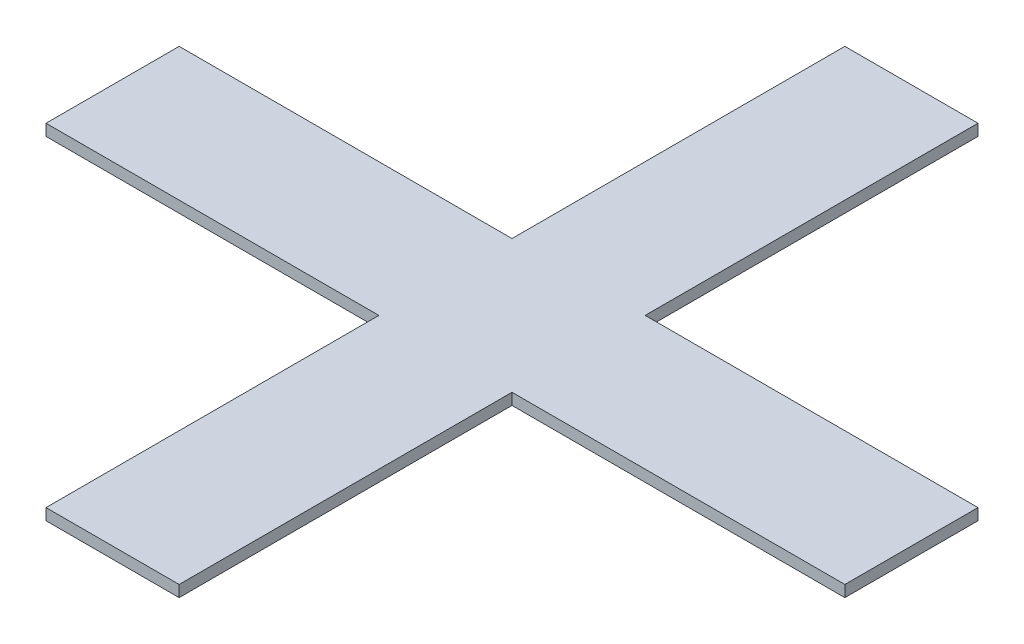
ISO-10303-21;
HEADER;
FILE_DESCRIPTION(('STEP AP214'),'2;1');
FILE_NAME('part.step','',(''),(''),'','','');
FILE_SCHEMA(('AUTOMOTIVE_DESIGN { 1 0 10303 214 1 1 1 1 }'));
ENDSEC;
DATA;
#1=APPLICATION_CONTEXT('core data for automotive mechanical design processes');
#2=APPLICATION_PROTOCOL_DEFINITION('international standard','automotive_design',2000,#1);
#3=PRODUCT_CONTEXT('',#1,'mechanical');
#4=PRODUCT('Part','Part','',(#3));
#5=PRODUCT_RELATED_PRODUCT_CATEGORY('part','',(#4));
#6=PRODUCT_DEFINITION_FORMATION('','',#4);
#7=PRODUCT_DEFINITION_CONTEXT('part definition',#1,'design');
#8=PRODUCT_DEFINITION('design','',#6,#7);
#9=PRODUCT_DEFINITION_SHAPE('','',#8);
#10=(LENGTH_UNIT() NAMED_UNIT(*) SI_UNIT(.MILLI.,.METRE.));
#11=(NAMED_UNIT(*) PLANE_ANGLE_UNIT() SI_UNIT($,.RADIAN.));
#12=(NAMED_UNIT(*) SI_UNIT($,.STERADIAN.) SOLID_ANGLE_UNIT());
#13=UNCERTAINTY_MEASURE_WITH_UNIT(LENGTH_MEASURE(1.E-05),#10,'distance_accuracy_value','');
#14=(GEOMETRIC_REPRESENTATION_CONTEXT(3) GLOBAL_UNCERTAINTY_ASSIGNED_CONTEXT((#13)) GLOBAL_UNIT_ASSIGNED_CONTEXT((#10,
#11,#12)) REPRESENTATION_CONTEXT('',''));
#15=CARTESIAN_POINT('',(0.,0.,0.));
#16=DIRECTION('',(0.,0.,1.));
#17=DIRECTION('',(1.,0.,0.));
#18=AXIS2_PLACEMENT_3D('',#15,#16,#17);
#19=CARTESIAN_POINT('',(-180.,5.15,-1.66533453693773E-13));
#20=DIRECTION('',(-1.,0.,0.));
#21=DIRECTION('',(0.,0.,1.));
#22=AXIS2_PLACEMENT_3D('',#19,#20,#21);
#23=PLANE('',#22);
#24=DIRECTION('',(0.,0.,-1.));
#25=VECTOR('',#24,1.);
#26=CARTESIAN_POINT('',(-180.,0.,-1.66533453693773E-13));
#27=LINE('',#26,#25);
#28=CARTESIAN_POINT('',(-180.,0.,29.9999999999999));
#29=VERTEX_POINT('',#28);
#30=CARTESIAN_POINT('',(-180.,0.,-30.));
#31=VERTEX_POINT('',#30);
#32=EDGE_CURVE('E156',#29,#31,#27,.T.);
#33=ORIENTED_EDGE('',*,*,#32,.F.);
#34=DIRECTION('',(0.,-1.,0.));
#35=VECTOR('',#34,1.);
#36=CARTESIAN_POINT('',(-180.,5.15,29.9999999999999));
#37=LINE('',#36,#35);
#38=CARTESIAN_POINT('',(-180.,5.15,29.9999999999999));
#39=VERTEX_POINT('',#38);
#40=EDGE_CURVE('E11',#39,#29,#37,.T.);
#41=ORIENTED_EDGE('',*,*,#40,.F.);
#42=DIRECTION('',(0.,0.,-1.));
#43=VECTOR('',#42,1.);
#44=CARTESIAN_POINT('',(-180.,5.15,-1.66533453693773E-13));
#45=LINE('',#44,#43);
#46=CARTESIAN_POINT('',(-180.,5.15,-30.));
#47=VERTEX_POINT('',#46);
#48=EDGE_CURVE('E179',#39,#47,#45,.T.);
#49=ORIENTED_EDGE('',*,*,#48,.T.);
#50=DIRECTION('',(0.,-1.,0.));
#51=VECTOR('',#50,1.);
#52=CARTESIAN_POINT('',(-180.,5.15,-30.));
#53=LINE('',#52,#51);
#54=EDGE_CURVE('E102',#47,#31,#53,.T.);
#55=ORIENTED_EDGE('',*,*,#54,.T.);
#56=EDGE_LOOP('',(#33,#41,#49,#55));
#57=FACE_BOUND('',#56,.T.);
#58=ADVANCED_FACE('F39',(#57),#23,.T.);
#59=CARTESIAN_POINT('',(0.,5.15,30.0000000000001));
#60=DIRECTION('',(0.,0.,-1.));
#61=DIRECTION('',(-1.,0.,0.));
#62=AXIS2_PLACEMENT_3D('',#59,#60,#61);
#63=PLANE('',#62);
#64=DIRECTION('',(1.,0.,0.));
#65=VECTOR('',#64,1.);
#66=CARTESIAN_POINT('',(0.,0.,30.0000000000001));
#67=LINE('',#66,#65);
#68=CARTESIAN_POINT('',(-30.,0.,30.));
#69=VERTEX_POINT('',#68);
#70=EDGE_CURVE('E159',#29,#69,#67,.T.);
#71=ORIENTED_EDGE('',*,*,#70,.T.);
#72=DIRECTION('',(0.,-1.,0.));
#73=VECTOR('',#72,1.);
#74=CARTESIAN_POINT('',(-30.,5.15,30.));
#75=LINE('',#74,#73);
#76=CARTESIAN_POINT('',(-30.,5.15,30.));
#77=VERTEX_POINT('',#76);
#78=EDGE_CURVE('E47',#77,#69,#75,.T.);
#79=ORIENTED_EDGE('',*,*,#78,.F.);
#80=DIRECTION('',(1.,0.,0.));
#81=VECTOR('',#80,1.);
#82=CARTESIAN_POINT('',(0.,5.15,30.0000000000001));
#83=LINE('',#82,#81);
#84=EDGE_CURVE('E248',#39,#77,#83,.T.);
#85=ORIENTED_EDGE('',*,*,#84,.F.);
#86=ORIENTED_EDGE('',*,*,#40,.T.);
#87=EDGE_LOOP('',(#71,#79,#85,#86));
#88=FACE_BOUND('',#87,.T.);
#89=ADVANCED_FACE('F251',(#88),#63,.F.);
#90=CARTESIAN_POINT('',(-29.9999999999999,5.15,0.));
#91=DIRECTION('',(1.,0.,0.));
#92=DIRECTION('',(0.,0.,-1.));
#93=AXIS2_PLACEMENT_3D('',#90,#91,#92);
#94=PLANE('',#93);
#95=DIRECTION('',(0.,0.,1.));
#96=VECTOR('',#95,1.);
#97=CARTESIAN_POINT('',(-29.9999999999999,0.,0.));
#98=LINE('',#97,#96);
#99=CARTESIAN_POINT('',(-30.0000000000001,0.,180.));
#100=VERTEX_POINT('',#99);
#101=EDGE_CURVE('E161',#69,#100,#98,.T.);
#102=ORIENTED_EDGE('',*,*,#101,.T.);
#103=DIRECTION('',(0.,-1.,0.));
#104=VECTOR('',#103,1.);
#105=CARTESIAN_POINT('',(-30.0000000000001,5.15,180.));
#106=LINE('',#105,#104);
#107=CARTESIAN_POINT('',(-30.0000000000001,5.15,180.));
#108=VERTEX_POINT('',#107);
#109=EDGE_CURVE('E198',#108,#100,#106,.T.);
#110=ORIENTED_EDGE('',*,*,#109,.F.);
#111=DIRECTION('',(0.,0.,1.));
#112=VECTOR('',#111,1.);
#113=CARTESIAN_POINT('',(-29.9999999999999,5.15,0.));
#114=LINE('',#113,#112);
#115=EDGE_CURVE('E207',#77,#108,#114,.T.);
#116=ORIENTED_EDGE('',*,*,#115,.F.);
#117=ORIENTED_EDGE('',*,*,#78,.T.);
#118=EDGE_LOOP('',(#102,#110,#116,#117));
#119=FACE_BOUND('',#118,.T.);
#120=ADVANCED_FACE('F205',(#119),#94,.F.);
#121=CARTESIAN_POINT('',(0.,5.15,180.));
#122=DIRECTION('',(0.,0.,-1.));
#123=DIRECTION('',(-1.,0.,0.));
#124=AXIS2_PLACEMENT_3D('',#121,#122,#123);
#125=PLANE('',#124);
#126=DIRECTION('',(1.,0.,0.));
#127=VECTOR('',#126,1.);
#128=CARTESIAN_POINT('',(0.,0.,180.));
#129=LINE('',#128,#127);
#130=CARTESIAN_POINT('',(29.9999999999999,0.,180.));
#131=VERTEX_POINT('',#130);
#132=EDGE_CURVE('E163',#100,#131,#129,.T.);
#133=ORIENTED_EDGE('',*,*,#132,.T.);
#134=DIRECTION('',(0.,-1.,0.));
#135=VECTOR('',#134,1.);
#136=CARTESIAN_POINT('',(29.9999999999999,5.15,180.));
#137=LINE('',#136,#135);
#138=CARTESIAN_POINT('',(29.9999999999999,5.15,180.));
#139=VERTEX_POINT('',#138);
#140=EDGE_CURVE('E195',#139,#131,#137,.T.);
#141=ORIENTED_EDGE('',*,*,#140,.F.);
#142=DIRECTION('',(1.,0.,0.));
#143=VECTOR('',#142,1.);
#144=CARTESIAN_POINT('',(0.,5.15,180.));
#145=LINE('',#144,#143);
#146=EDGE_CURVE('E226',#108,#139,#145,.T.);
#147=ORIENTED_EDGE('',*,*,#146,.F.);
#148=ORIENTED_EDGE('',*,*,#109,.T.);
#149=EDGE_LOOP('',(#133,#141,#147,#148));
#150=FACE_BOUND('',#149,.T.);
#151=ADVANCED_FACE('F217',(#150),#125,.F.);
#152=CARTESIAN_POINT('',(30.,5.15,0.));
#153=DIRECTION('',(-1.,0.,0.));
#154=DIRECTION('',(0.,0.,1.));
#155=AXIS2_PLACEMENT_3D('',#152,#153,#154);
#156=PLANE('',#155);
#157=DIRECTION('',(0.,0.,-1.));
#158=VECTOR('',#157,1.);
#159=CARTESIAN_POINT('',(30.,0.,0.));
#160=LINE('',#159,#158);
#161=CARTESIAN_POINT('',(30.,0.,30.));
#162=VERTEX_POINT('',#161);
#163=EDGE_CURVE('E165',#131,#162,#160,.T.);
#164=ORIENTED_EDGE('',*,*,#163,.T.);
#165=DIRECTION('',(0.,-1.,0.));
#166=VECTOR('',#165,1.);
#167=CARTESIAN_POINT('',(30.,5.15,30.));
#168=LINE('',#167,#166);
#169=CARTESIAN_POINT('',(30.,5.15,30.));
#170=VERTEX_POINT('',#169);
#171=EDGE_CURVE('E192',#170,#162,#168,.T.);
#172=ORIENTED_EDGE('',*,*,#171,.F.);
#173=DIRECTION('',(0.,0.,-1.));
#174=VECTOR('',#173,1.);
#175=CARTESIAN_POINT('',(30.,5.15,0.));
#176=LINE('',#175,#174);
#177=EDGE_CURVE('E223',#139,#170,#176,.T.);
#178=ORIENTED_EDGE('',*,*,#177,.F.);
#179=ORIENTED_EDGE('',*,*,#140,.T.);
#180=EDGE_LOOP('',(#164,#172,#178,#179));
#181=FACE_BOUND('',#180,.T.);
#182=ADVANCED_FACE('F221',(#181),#156,.F.);
#183=CARTESIAN_POINT('',(0.,5.15,29.9999999999999));
#184=DIRECTION('',(0.,0.,-1.));
#185=DIRECTION('',(-1.,0.,0.));
#186=AXIS2_PLACEMENT_3D('',#183,#184,#185);
#187=PLANE('',#186);
#188=DIRECTION('',(1.,0.,0.));
#189=VECTOR('',#188,1.);
#190=CARTESIAN_POINT('',(0.,0.,29.9999999999999));
#191=LINE('',#190,#189);
#192=CARTESIAN_POINT('',(180.,0.,30.));
#193=VERTEX_POINT('',#192);
#194=EDGE_CURVE('E167',#162,#193,#191,.T.);
#195=ORIENTED_EDGE('',*,*,#194,.T.);
#196=DIRECTION('',(0.,-1.,0.));
#197=VECTOR('',#196,1.);
#198=CARTESIAN_POINT('',(180.,5.15,30.));
#199=LINE('',#198,#197);
#200=CARTESIAN_POINT('',(180.,5.15,30.));
#201=VERTEX_POINT('',#200);
#202=EDGE_CURVE('E189',#201,#193,#199,.T.);
#203=ORIENTED_EDGE('',*,*,#202,.F.);
#204=DIRECTION('',(1.,0.,0.));
#205=VECTOR('',#204,1.);
#206=CARTESIAN_POINT('',(0.,5.15,29.9999999999999));
#207=LINE('',#206,#205);
#208=EDGE_CURVE('E225',#170,#201,#207,.T.);
#209=ORIENTED_EDGE('',*,*,#208,.F.);
#210=ORIENTED_EDGE('',*,*,#171,.T.);
#211=EDGE_LOOP('',(#195,#203,#209,#210));
#212=FACE_BOUND('',#211,.T.);
#213=ADVANCED_FACE('F263',(#212),#187,.F.);
#214=CARTESIAN_POINT('',(180.,5.15,0.));
#215=DIRECTION('',(-1.,0.,0.));
#216=DIRECTION('',(0.,0.,1.));
#217=AXIS2_PLACEMENT_3D('',#214,#215,#216);
#218=PLANE('',#217);
#219=DIRECTION('',(0.,0.,-1.));
#220=VECTOR('',#219,1.);
#221=CARTESIAN_POINT('',(180.,0.,0.));
#222=LINE('',#221,#220);
#223=CARTESIAN_POINT('',(180.,0.,-30.));
#224=VERTEX_POINT('',#223);
#225=EDGE_CURVE('E169',#193,#224,#222,.T.);
#226=ORIENTED_EDGE('',*,*,#225,.T.);
#227=DIRECTION('',(0.,-1.,0.));
#228=VECTOR('',#227,1.);
#229=CARTESIAN_POINT('',(180.,5.15,-30.));
#230=LINE('',#229,#228);
#231=CARTESIAN_POINT('',(180.,5.15,-30.));
#232=VERTEX_POINT('',#231);
#233=EDGE_CURVE('E186',#232,#224,#230,.T.);
#234=ORIENTED_EDGE('',*,*,#233,.F.);
#235=DIRECTION('',(0.,0.,-1.));
#236=VECTOR('',#235,1.);
#237=CARTESIAN_POINT('',(180.,5.15,0.));
#238=LINE('',#237,#236);
#239=EDGE_CURVE('E228',#201,#232,#238,.T.);
#240=ORIENTED_EDGE('',*,*,#239,.F.);
#241=ORIENTED_EDGE('',*,*,#202,.T.);
#242=EDGE_LOOP('',(#226,#234,#240,#241));
#243=FACE_BOUND('',#242,.T.);
#244=ADVANCED_FACE('F266',(#243),#218,.F.);
#245=CARTESIAN_POINT('',(0.,5.15,-30.));
#246=DIRECTION('',(0.,0.,1.));
#247=DIRECTION('',(1.,0.,0.));
#248=AXIS2_PLACEMENT_3D('',#245,#246,#247);
#249=PLANE('',#248);
#250=DIRECTION('',(-1.,0.,0.));
#251=VECTOR('',#250,1.);
#252=CARTESIAN_POINT('',(0.,0.,-30.));
#253=LINE('',#252,#251);
#254=CARTESIAN_POINT('',(30.,0.,-30.));
#255=VERTEX_POINT('',#254);
#256=EDGE_CURVE('E171',#224,#255,#253,.T.);
#257=ORIENTED_EDGE('',*,*,#256,.T.);
#258=DIRECTION('',(0.,-1.,0.));
#259=VECTOR('',#258,1.);
#260=CARTESIAN_POINT('',(30.,5.15,-30.));
#261=LINE('',#260,#259);
#262=CARTESIAN_POINT('',(30.,5.15,-30.));
#263=VERTEX_POINT('',#262);
#264=EDGE_CURVE('E183',#263,#255,#261,.T.);
#265=ORIENTED_EDGE('',*,*,#264,.F.);
#266=DIRECTION('',(-1.,0.,0.));
#267=VECTOR('',#266,1.);
#268=CARTESIAN_POINT('',(0.,5.15,-30.));
#269=LINE('',#268,#267);
#270=EDGE_CURVE('E234',#232,#263,#269,.T.);
#271=ORIENTED_EDGE('',*,*,#270,.F.);
#272=ORIENTED_EDGE('',*,*,#233,.T.);
#273=EDGE_LOOP('',(#257,#265,#271,#272));
#274=FACE_BOUND('',#273,.T.);
#275=ADVANCED_FACE('F240',(#274),#249,.F.);
#276=CARTESIAN_POINT('',(30.,5.15,0.));
#277=DIRECTION('',(-1.,0.,0.));
#278=DIRECTION('',(0.,0.,1.));
#279=AXIS2_PLACEMENT_3D('',#276,#277,#278);
#280=PLANE('',#279);
#281=DIRECTION('',(0.,0.,-1.));
#282=VECTOR('',#281,1.);
#283=CARTESIAN_POINT('',(30.,0.,0.));
#284=LINE('',#283,#282);
#285=CARTESIAN_POINT('',(30.,0.,-180.));
#286=VERTEX_POINT('',#285);
#287=EDGE_CURVE('E173',#255,#286,#284,.T.);
#288=ORIENTED_EDGE('',*,*,#287,.T.);
#289=DIRECTION('',(0.,-1.,0.));
#290=VECTOR('',#289,1.);
#291=CARTESIAN_POINT('',(30.,5.15,-180.));
#292=LINE('',#291,#290);
#293=CARTESIAN_POINT('',(30.,5.15,-180.));
#294=VERTEX_POINT('',#293);
#295=EDGE_CURVE('E148',#294,#286,#292,.T.);
#296=ORIENTED_EDGE('',*,*,#295,.F.);
#297=DIRECTION('',(0.,0.,-1.));
#298=VECTOR('',#297,1.);
#299=CARTESIAN_POINT('',(30.,5.15,0.));
#300=LINE('',#299,#298);
#301=EDGE_CURVE('E139',#263,#294,#300,.T.);
#302=ORIENTED_EDGE('',*,*,#301,.F.);
#303=ORIENTED_EDGE('',*,*,#264,.T.);
#304=EDGE_LOOP('',(#288,#296,#302,#303));
#305=FACE_BOUND('',#304,.T.);
#306=ADVANCED_FACE('F244',(#305),#280,.F.);
#307=CARTESIAN_POINT('',(0.,5.15,-180.));
#308=DIRECTION('',(0.,0.,1.));
#309=DIRECTION('',(1.,0.,0.));
#310=AXIS2_PLACEMENT_3D('',#307,#308,#309);
#311=PLANE('',#310);
#312=DIRECTION('',(-1.,0.,0.));
#313=VECTOR('',#312,1.);
#314=CARTESIAN_POINT('',(0.,0.,-180.));
#315=LINE('',#314,#313);
#316=CARTESIAN_POINT('',(-30.,0.,-180.));
#317=VERTEX_POINT('',#316);
#318=EDGE_CURVE('E147',#286,#317,#315,.T.);
#319=ORIENTED_EDGE('',*,*,#318,.T.);
#320=DIRECTION('',(0.,-1.,0.));
#321=VECTOR('',#320,1.);
#322=CARTESIAN_POINT('',(-30.,5.15,-180.));
#323=LINE('',#322,#321);
#324=CARTESIAN_POINT('',(-30.,5.15,-180.));
#325=VERTEX_POINT('',#324);
#326=EDGE_CURVE('E144',#325,#317,#323,.T.);
#327=ORIENTED_EDGE('',*,*,#326,.F.);
#328=DIRECTION('',(-1.,0.,0.));
#329=VECTOR('',#328,1.);
#330=CARTESIAN_POINT('',(0.,5.15,-180.));
#331=LINE('',#330,#329);
#332=EDGE_CURVE('E133',#294,#325,#331,.T.);
#333=ORIENTED_EDGE('',*,*,#332,.F.);
#334=ORIENTED_EDGE('',*,*,#295,.T.);
#335=EDGE_LOOP('',(#319,#327,#333,#334));
#336=FACE_BOUND('',#335,.T.);
#337=ADVANCED_FACE('F145',(#336),#311,.F.);
#338=CARTESIAN_POINT('',(-30.,5.15,0.));
#339=DIRECTION('',(1.,0.,0.));
#340=DIRECTION('',(0.,0.,-1.));
#341=AXIS2_PLACEMENT_3D('',#338,#339,#340);
#342=PLANE('',#341);
#343=DIRECTION('',(0.,0.,1.));
#344=VECTOR('',#343,1.);
#345=CARTESIAN_POINT('',(-30.,0.,0.));
#346=LINE('',#345,#344);
#347=CARTESIAN_POINT('',(-30.,0.,-30.));
#348=VERTEX_POINT('',#347);
#349=EDGE_CURVE('E95',#317,#348,#346,.T.);
#350=ORIENTED_EDGE('',*,*,#349,.T.);
#351=DIRECTION('',(0.,-1.,0.));
#352=VECTOR('',#351,1.);
#353=CARTESIAN_POINT('',(-30.,5.15,-30.));
#354=LINE('',#353,#352);
#355=CARTESIAN_POINT('',(-30.,5.15,-30.));
#356=VERTEX_POINT('',#355);
#357=EDGE_CURVE('E149',#356,#348,#354,.T.);
#358=ORIENTED_EDGE('',*,*,#357,.F.);
#359=DIRECTION('',(0.,0.,1.));
#360=VECTOR('',#359,1.);
#361=CARTESIAN_POINT('',(-30.,5.15,0.));
#362=LINE('',#361,#360);
#363=EDGE_CURVE('E137',#325,#356,#362,.T.);
#364=ORIENTED_EDGE('',*,*,#363,.F.);
#365=ORIENTED_EDGE('',*,*,#326,.T.);
#366=EDGE_LOOP('',(#350,#358,#364,#365));
#367=FACE_BOUND('',#366,.T.);
#368=ADVANCED_FACE('F151',(#367),#342,.F.);
#369=CARTESIAN_POINT('',(0.,5.15,-30.));
#370=DIRECTION('',(0.,0.,1.));
#371=DIRECTION('',(1.,0.,0.));
#372=AXIS2_PLACEMENT_3D('',#369,#370,#371);
#373=PLANE('',#372);
#374=DIRECTION('',(-1.,0.,0.));
#375=VECTOR('',#374,1.);
#376=CARTESIAN_POINT('',(0.,0.,-30.));
#377=LINE('',#376,#375);
#378=EDGE_CURVE('E177',#348,#31,#377,.T.);
#379=ORIENTED_EDGE('',*,*,#378,.T.);
#380=ORIENTED_EDGE('',*,*,#54,.F.);
#381=DIRECTION('',(-1.,0.,0.));
#382=VECTOR('',#381,1.);
#383=CARTESIAN_POINT('',(0.,5.15,-30.));
#384=LINE('',#383,#382);
#385=EDGE_CURVE('E55',#356,#47,#384,.T.);
#386=ORIENTED_EDGE('',*,*,#385,.F.);
#387=ORIENTED_EDGE('',*,*,#357,.T.);
#388=EDGE_LOOP('',(#379,#380,#386,#387));
#389=FACE_BOUND('',#388,.T.);
#390=ADVANCED_FACE('F247',(#389),#373,.F.);
#391=CARTESIAN_POINT('',(0.,5.15,0.));
#392=DIRECTION('',(0.,1.,0.));
#393=DIRECTION('',(0.,0.,1.));
#394=AXIS2_PLACEMENT_3D('',#391,#392,#393);
#395=PLANE('',#394);
#396=ORIENTED_EDGE('',*,*,#48,.F.);
#397=ORIENTED_EDGE('',*,*,#84,.T.);
#398=ORIENTED_EDGE('',*,*,#115,.T.);
#399=ORIENTED_EDGE('',*,*,#146,.T.);
#400=ORIENTED_EDGE('',*,*,#177,.T.);
#401=ORIENTED_EDGE('',*,*,#208,.T.);
#402=ORIENTED_EDGE('',*,*,#239,.T.);
#403=ORIENTED_EDGE('',*,*,#270,.T.);
#404=ORIENTED_EDGE('',*,*,#301,.T.);
#405=ORIENTED_EDGE('',*,*,#332,.T.);
#406=ORIENTED_EDGE('',*,*,#363,.T.);
#407=ORIENTED_EDGE('',*,*,#385,.T.);
#408=EDGE_LOOP('',(#396,#397,#398,#399,#400,#401,#402,#403,#404,#405,#406,#407));
#409=FACE_BOUND('',#408,.T.);
#410=ADVANCED_FACE('F135',(#409),#395,.T.);
#411=CARTESIAN_POINT('',(0.,0.,0.));
#412=DIRECTION('',(0.,1.,0.));
#413=DIRECTION('',(0.,0.,1.));
#414=AXIS2_PLACEMENT_3D('',#411,#412,#413);
#415=PLANE('',#414);
#416=ORIENTED_EDGE('',*,*,#32,.T.);
#417=ORIENTED_EDGE('',*,*,#378,.F.);
#418=ORIENTED_EDGE('',*,*,#349,.F.);
#419=ORIENTED_EDGE('',*,*,#318,.F.);
#420=ORIENTED_EDGE('',*,*,#287,.F.);
#421=ORIENTED_EDGE('',*,*,#256,.F.);
#422=ORIENTED_EDGE('',*,*,#225,.F.);
#423=ORIENTED_EDGE('',*,*,#194,.F.);
#424=ORIENTED_EDGE('',*,*,#163,.F.);
#425=ORIENTED_EDGE('',*,*,#132,.F.);
#426=ORIENTED_EDGE('',*,*,#101,.F.);
#427=ORIENTED_EDGE('',*,*,#70,.F.);
#428=EDGE_LOOP('',(#416,#417,#418,#419,#420,#421,#422,#423,#424,#425,#426,#427));
#429=FACE_BOUND('',#428,.T.);
#430=ADVANCED_FACE('F212',(#429),#415,.F.);
#431=CLOSED_SHELL('',(#58,#89,#120,#151,#182,#213,#244,#275,#306,#337,#368,#390,#410,#430));
#432=MANIFOLD_SOLID_BREP('B2',#431);
#433=ADVANCED_BREP_SHAPE_REPRESENTATION('',(#18,#432),#14);
#434=SHAPE_DEFINITION_REPRESENTATION(#9,#433);
ENDSEC;
END-ISO-10303-21;
